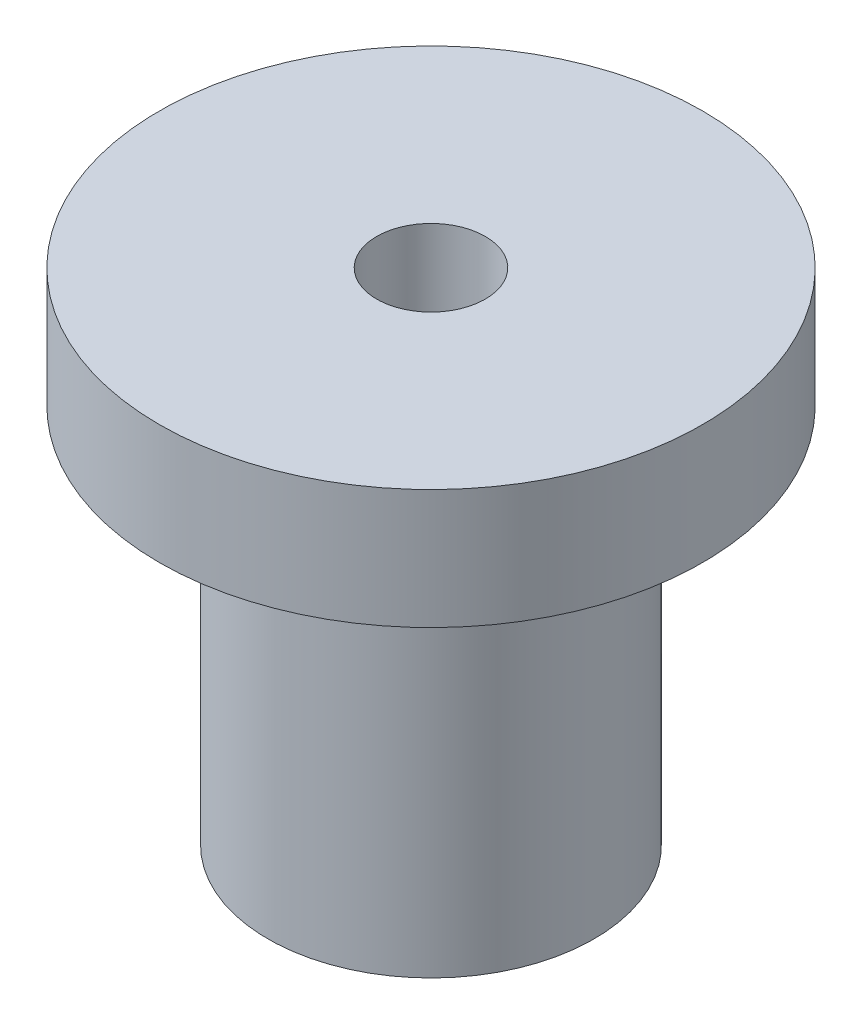
ISO-10303-21;
HEADER;
FILE_DESCRIPTION(('STEP AP214'),'2;1');
FILE_NAME('part.step','',(''),(''),'','','');
FILE_SCHEMA(('AUTOMOTIVE_DESIGN { 1 0 10303 214 1 1 1 1 }'));
ENDSEC;
DATA;
#1=APPLICATION_CONTEXT('core data for automotive mechanical design processes');
#2=APPLICATION_PROTOCOL_DEFINITION('international standard','automotive_design',2000,#1);
#3=PRODUCT_CONTEXT('',#1,'mechanical');
#4=PRODUCT('Part','Part','',(#3));
#5=PRODUCT_RELATED_PRODUCT_CATEGORY('part','',(#4));
#6=PRODUCT_DEFINITION_FORMATION('','',#4);
#7=PRODUCT_DEFINITION_CONTEXT('part definition',#1,'design');
#8=PRODUCT_DEFINITION('design','',#6,#7);
#9=PRODUCT_DEFINITION_SHAPE('','',#8);
#10=(LENGTH_UNIT() NAMED_UNIT(*) SI_UNIT(.MILLI.,.METRE.));
#11=(NAMED_UNIT(*) PLANE_ANGLE_UNIT() SI_UNIT($,.RADIAN.));
#12=(NAMED_UNIT(*) SI_UNIT($,.STERADIAN.) SOLID_ANGLE_UNIT());
#13=UNCERTAINTY_MEASURE_WITH_UNIT(LENGTH_MEASURE(1.E-05),#10,'distance_accuracy_value','');
#14=(GEOMETRIC_REPRESENTATION_CONTEXT(3) GLOBAL_UNCERTAINTY_ASSIGNED_CONTEXT((#13)) GLOBAL_UNIT_ASSIGNED_CONTEXT((#10,
#11,#12)) REPRESENTATION_CONTEXT('',''));
#15=CARTESIAN_POINT('',(0.,0.,0.));
#16=DIRECTION('',(0.,0.,1.));
#17=DIRECTION('',(1.,0.,0.));
#18=AXIS2_PLACEMENT_3D('',#15,#16,#17);
#19=CARTESIAN_POINT('',(0.,0.,0.));
#20=DIRECTION('',(0.,-1.,0.));
#21=DIRECTION('',(0.,0.,-1.));
#22=AXIS2_PLACEMENT_3D('',#19,#20,#21);
#23=CYLINDRICAL_SURFACE('',#22,25.);
#24=CARTESIAN_POINT('',(0.,0.,0.));
#25=DIRECTION('',(0.,-1.,0.));
#26=DIRECTION('',(0.,0.,-1.));
#27=AXIS2_PLACEMENT_3D('',#24,#25,#26);
#28=CIRCLE('',#27,25.);
#29=CARTESIAN_POINT('',(0.,0.,-25.));
#30=VERTEX_POINT('',#29);
#31=EDGE_CURVE('E10',#30,#30,#28,.T.);
#32=ORIENTED_EDGE('',*,*,#31,.T.);
#33=EDGE_LOOP('',(#32));
#34=FACE_BOUND('',#33,.T.);
#35=CARTESIAN_POINT('',(0.,230.,0.));
#36=DIRECTION('',(0.,-1.,0.));
#37=DIRECTION('',(0.,0.,-1.));
#38=AXIS2_PLACEMENT_3D('',#35,#36,#37);
#39=CIRCLE('',#38,25.);
#40=CARTESIAN_POINT('',(0.,230.,-25.));
#41=VERTEX_POINT('',#40);
#42=EDGE_CURVE('E68',#41,#41,#39,.T.);
#43=ORIENTED_EDGE('',*,*,#42,.F.);
#44=EDGE_LOOP('',(#43));
#45=FACE_BOUND('',#44,.T.);
#46=ADVANCED_FACE('F41',(#34,#45),#23,.F.);
#47=CARTESIAN_POINT('',(25.,0.,0.));
#48=DIRECTION('',(0.,-1.,0.));
#49=DIRECTION('',(0.,0.,-1.));
#50=AXIS2_PLACEMENT_3D('',#47,#48,#49);
#51=PLANE('',#50);
#52=CARTESIAN_POINT('',(0.,0.,0.));
#53=DIRECTION('',(0.,-1.,0.));
#54=DIRECTION('',(0.,0.,-1.));
#55=AXIS2_PLACEMENT_3D('',#52,#53,#54);
#56=CIRCLE('',#55,75.);
#57=CARTESIAN_POINT('',(0.,0.,-75.));
#58=VERTEX_POINT('',#57);
#59=EDGE_CURVE('E48',#58,#58,#56,.T.);
#60=ORIENTED_EDGE('',*,*,#59,.T.);
#61=EDGE_LOOP('',(#60));
#62=FACE_BOUND('',#61,.T.);
#63=ORIENTED_EDGE('',*,*,#31,.F.);
#64=EDGE_LOOP('',(#63));
#65=FACE_BOUND('',#64,.T.);
#66=ADVANCED_FACE('F77',(#62,#65),#51,.T.);
#67=CARTESIAN_POINT('',(0.,0.,0.));
#68=DIRECTION('',(0.,-1.,0.));
#69=DIRECTION('',(0.,0.,-1.));
#70=AXIS2_PLACEMENT_3D('',#67,#68,#69);
#71=CYLINDRICAL_SURFACE('',#70,75.);
#72=CARTESIAN_POINT('',(0.,175.,0.));
#73=DIRECTION('',(0.,-1.,0.));
#74=DIRECTION('',(0.,0.,-1.));
#75=AXIS2_PLACEMENT_3D('',#72,#73,#74);
#76=CIRCLE('',#75,75.);
#77=CARTESIAN_POINT('',(0.,175.,-75.));
#78=VERTEX_POINT('',#77);
#79=EDGE_CURVE('E53',#78,#78,#76,.T.);
#80=ORIENTED_EDGE('',*,*,#79,.T.);
#81=EDGE_LOOP('',(#80));
#82=FACE_BOUND('',#81,.T.);
#83=ORIENTED_EDGE('',*,*,#59,.F.);
#84=EDGE_LOOP('',(#83));
#85=FACE_BOUND('',#84,.T.);
#86=ADVANCED_FACE('F81',(#82,#85),#71,.T.);
#87=CARTESIAN_POINT('',(75.,175.,0.));
#88=DIRECTION('',(0.,-1.,0.));
#89=DIRECTION('',(0.,0.,-1.));
#90=AXIS2_PLACEMENT_3D('',#87,#88,#89);
#91=PLANE('',#90);
#92=CARTESIAN_POINT('',(0.,175.,0.));
#93=DIRECTION('',(0.,-1.,0.));
#94=DIRECTION('',(0.,0.,-1.));
#95=AXIS2_PLACEMENT_3D('',#92,#93,#94);
#96=CIRCLE('',#95,125.);
#97=CARTESIAN_POINT('',(0.,175.,-125.));
#98=VERTEX_POINT('',#97);
#99=EDGE_CURVE('E58',#98,#98,#96,.T.);
#100=ORIENTED_EDGE('',*,*,#99,.T.);
#101=EDGE_LOOP('',(#100));
#102=FACE_BOUND('',#101,.T.);
#103=ORIENTED_EDGE('',*,*,#79,.F.);
#104=EDGE_LOOP('',(#103));
#105=FACE_BOUND('',#104,.T.);
#106=ADVANCED_FACE('F85',(#102,#105),#91,.T.);
#107=CARTESIAN_POINT('',(0.,0.,0.));
#108=DIRECTION('',(0.,-1.,0.));
#109=DIRECTION('',(0.,0.,-1.));
#110=AXIS2_PLACEMENT_3D('',#107,#108,#109);
#111=CYLINDRICAL_SURFACE('',#110,125.);
#112=CARTESIAN_POINT('',(0.,230.,0.));
#113=DIRECTION('',(0.,-1.,0.));
#114=DIRECTION('',(0.,0.,-1.));
#115=AXIS2_PLACEMENT_3D('',#112,#113,#114);
#116=CIRCLE('',#115,125.);
#117=CARTESIAN_POINT('',(0.,230.,-125.));
#118=VERTEX_POINT('',#117);
#119=EDGE_CURVE('E64',#118,#118,#116,.T.);
#120=ORIENTED_EDGE('',*,*,#119,.T.);
#121=EDGE_LOOP('',(#120));
#122=FACE_BOUND('',#121,.T.);
#123=ORIENTED_EDGE('',*,*,#99,.F.);
#124=EDGE_LOOP('',(#123));
#125=FACE_BOUND('',#124,.T.);
#126=ADVANCED_FACE('F92',(#122,#125),#111,.T.);
#127=CARTESIAN_POINT('',(125.,230.,0.));
#128=DIRECTION('',(0.,1.,0.));
#129=DIRECTION('',(0.,0.,1.));
#130=AXIS2_PLACEMENT_3D('',#127,#128,#129);
#131=PLANE('',#130);
#132=ORIENTED_EDGE('',*,*,#42,.T.);
#133=EDGE_LOOP('',(#132));
#134=FACE_BOUND('',#133,.T.);
#135=ORIENTED_EDGE('',*,*,#119,.F.);
#136=EDGE_LOOP('',(#135));
#137=FACE_BOUND('',#136,.T.);
#138=ADVANCED_FACE('F73',(#134,#137),#131,.T.);
#139=CLOSED_SHELL('',(#46,#66,#86,#106,#126,#138));
#140=MANIFOLD_SOLID_BREP('B2',#139);
#141=ADVANCED_BREP_SHAPE_REPRESENTATION('',(#18,#140),#14);
#142=SHAPE_DEFINITION_REPRESENTATION(#9,#141);
ENDSEC;
END-ISO-10303-21;
